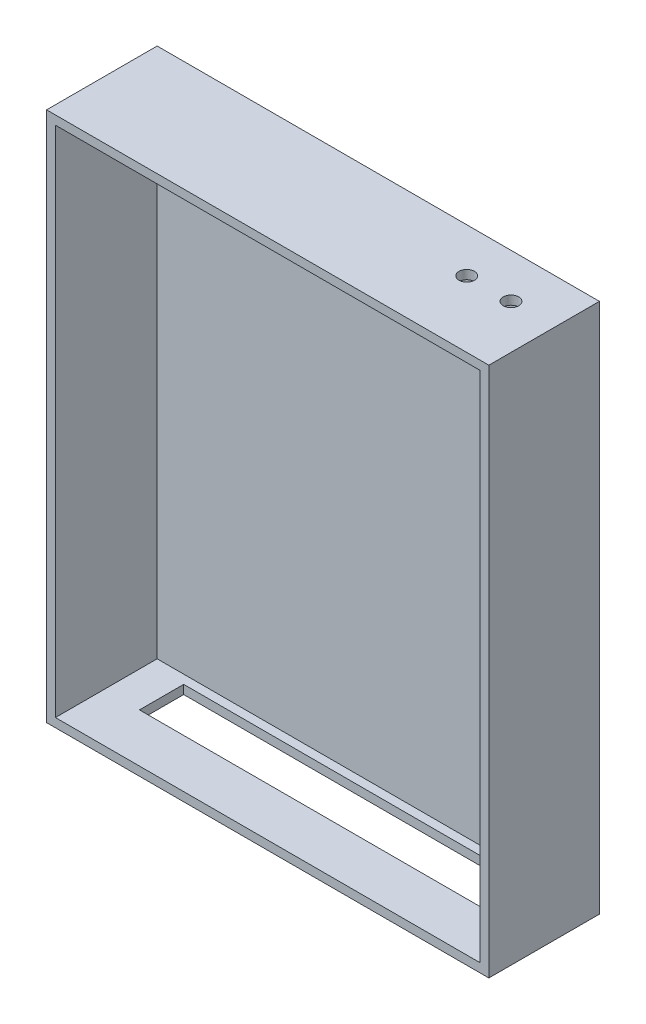
ISO-10303-21;
HEADER;
FILE_DESCRIPTION(('STEP AP214'),'2;1');
FILE_NAME('part.step','',(''),(''),'','','');
FILE_SCHEMA(('AUTOMOTIVE_DESIGN { 1 0 10303 214 1 1 1 1 }'));
ENDSEC;
DATA;
#1=APPLICATION_CONTEXT('core data for automotive mechanical design processes');
#2=APPLICATION_PROTOCOL_DEFINITION('international standard','automotive_design',2000,#1);
#3=PRODUCT_CONTEXT('',#1,'mechanical');
#4=PRODUCT('Part','Part','',(#3));
#5=PRODUCT_RELATED_PRODUCT_CATEGORY('part','',(#4));
#6=PRODUCT_DEFINITION_FORMATION('','',#4);
#7=PRODUCT_DEFINITION_CONTEXT('part definition',#1,'design');
#8=PRODUCT_DEFINITION('design','',#6,#7);
#9=PRODUCT_DEFINITION_SHAPE('','',#8);
#10=(LENGTH_UNIT() NAMED_UNIT(*) SI_UNIT(.MILLI.,.METRE.));
#11=(NAMED_UNIT(*) PLANE_ANGLE_UNIT() SI_UNIT($,.RADIAN.));
#12=(NAMED_UNIT(*) SI_UNIT($,.STERADIAN.) SOLID_ANGLE_UNIT());
#13=UNCERTAINTY_MEASURE_WITH_UNIT(LENGTH_MEASURE(1.E-05),#10,'distance_accuracy_value','');
#14=(GEOMETRIC_REPRESENTATION_CONTEXT(3) GLOBAL_UNCERTAINTY_ASSIGNED_CONTEXT((#13)) GLOBAL_UNIT_ASSIGNED_CONTEXT((#10,
#11,#12)) REPRESENTATION_CONTEXT('',''));
#15=CARTESIAN_POINT('',(0.,0.,0.));
#16=DIRECTION('',(0.,0.,1.));
#17=DIRECTION('',(1.,0.,0.));
#18=AXIS2_PLACEMENT_3D('',#15,#16,#17);
#19=CARTESIAN_POINT('',(0.,0.,0.));
#20=DIRECTION('',(0.,0.,1.));
#21=DIRECTION('',(1.,0.,0.));
#22=AXIS2_PLACEMENT_3D('',#19,#20,#21);
#23=PLANE('',#22);
#24=DIRECTION('',(1.,0.,0.));
#25=VECTOR('',#24,1.);
#26=CARTESIAN_POINT('',(100.,-60.,0.));
#27=LINE('',#26,#25);
#28=CARTESIAN_POINT('',(0.,-60.,0.));
#29=VERTEX_POINT('',#28);
#30=CARTESIAN_POINT('',(100.,-60.,0.));
#31=VERTEX_POINT('',#30);
#32=EDGE_CURVE('E163',#29,#31,#27,.T.);
#33=ORIENTED_EDGE('',*,*,#32,.T.);
#34=DIRECTION('',(0.,1.,0.));
#35=VECTOR('',#34,1.);
#36=CARTESIAN_POINT('',(100.,0.,0.));
#37=LINE('',#36,#35);
#38=CARTESIAN_POINT('',(100.,60.,0.));
#39=VERTEX_POINT('',#38);
#40=EDGE_CURVE('E158',#31,#39,#37,.T.);
#41=ORIENTED_EDGE('',*,*,#40,.T.);
#42=DIRECTION('',(-1.,0.,0.));
#43=VECTOR('',#42,1.);
#44=CARTESIAN_POINT('',(100.,60.,0.));
#45=LINE('',#44,#43);
#46=CARTESIAN_POINT('',(0.,60.,0.));
#47=VERTEX_POINT('',#46);
#48=EDGE_CURVE('E270',#39,#47,#45,.T.);
#49=ORIENTED_EDGE('',*,*,#48,.T.);
#50=DIRECTION('',(0.,1.,0.));
#51=VECTOR('',#50,1.);
#52=CARTESIAN_POINT('',(0.,0.,0.));
#53=LINE('',#52,#51);
#54=EDGE_CURVE('E153',#29,#47,#53,.T.);
#55=ORIENTED_EDGE('',*,*,#54,.F.);
#56=EDGE_LOOP('',(#33,#41,#49,#55));
#57=FACE_BOUND('',#56,.T.);
#58=DIRECTION('',(0.,1.,0.));
#59=VECTOR('',#58,1.);
#60=CARTESIAN_POINT('',(98.,0.,0.));
#61=LINE('',#60,#59);
#62=CARTESIAN_POINT('',(98.,-58.,0.));
#63=VERTEX_POINT('',#62);
#64=CARTESIAN_POINT('',(98.,58.,0.));
#65=VERTEX_POINT('',#64);
#66=EDGE_CURVE('E212',#63,#65,#61,.T.);
#67=ORIENTED_EDGE('',*,*,#66,.F.);
#68=DIRECTION('',(1.,0.,0.));
#69=VECTOR('',#68,1.);
#70=CARTESIAN_POINT('',(100.,-58.,0.));
#71=LINE('',#70,#69);
#72=CARTESIAN_POINT('',(2.,-58.,0.));
#73=VERTEX_POINT('',#72);
#74=EDGE_CURVE('E152',#73,#63,#71,.T.);
#75=ORIENTED_EDGE('',*,*,#74,.F.);
#76=DIRECTION('',(0.,1.,0.));
#77=VECTOR('',#76,1.);
#78=CARTESIAN_POINT('',(2.,0.,0.));
#79=LINE('',#78,#77);
#80=CARTESIAN_POINT('',(2.,58.,0.));
#81=VERTEX_POINT('',#80);
#82=EDGE_CURVE('E136',#73,#81,#79,.T.);
#83=ORIENTED_EDGE('',*,*,#82,.T.);
#84=DIRECTION('',(-1.,0.,0.));
#85=VECTOR('',#84,1.);
#86=CARTESIAN_POINT('',(100.,58.,0.));
#87=LINE('',#86,#85);
#88=EDGE_CURVE('E147',#65,#81,#87,.T.);
#89=ORIENTED_EDGE('',*,*,#88,.F.);
#90=EDGE_LOOP('',(#67,#75,#83,#89));
#91=FACE_BOUND('',#90,.T.);
#92=ADVANCED_FACE('F40',(#57,#91),#23,.T.);
#93=CARTESIAN_POINT('',(100.,60.,25.));
#94=DIRECTION('',(0.,-1.,0.));
#95=DIRECTION('',(0.,0.,-1.));
#96=AXIS2_PLACEMENT_3D('',#93,#94,#95);
#97=PLANE('',#96);
#98=CARTESIAN_POINT('',(90.,60.,-15.));
#99=DIRECTION('',(0.,1.,0.));
#100=DIRECTION('',(0.,0.,1.));
#101=AXIS2_PLACEMENT_3D('',#98,#99,#100);
#102=CIRCLE('',#101,1.75);
#103=CARTESIAN_POINT('',(90.,60.,-13.25));
#104=VERTEX_POINT('',#103);
#105=EDGE_CURVE('E195',#104,#104,#102,.T.);
#106=ORIENTED_EDGE('',*,*,#105,.F.);
#107=EDGE_LOOP('',(#106));
#108=FACE_BOUND('',#107,.T.);
#109=CARTESIAN_POINT('',(80.,60.,-15.));
#110=DIRECTION('',(0.,1.,0.));
#111=DIRECTION('',(0.,0.,1.));
#112=AXIS2_PLACEMENT_3D('',#109,#110,#111);
#113=CIRCLE('',#112,1.75);
#114=CARTESIAN_POINT('',(80.,60.,-13.25));
#115=VERTEX_POINT('',#114);
#116=EDGE_CURVE('E200',#115,#115,#113,.T.);
#117=ORIENTED_EDGE('',*,*,#116,.F.);
#118=EDGE_LOOP('',(#117));
#119=FACE_BOUND('',#118,.T.);
#120=ORIENTED_EDGE('',*,*,#48,.F.);
#121=DIRECTION('',(0.,0.,1.));
#122=VECTOR('',#121,1.);
#123=CARTESIAN_POINT('',(100.,60.,25.));
#124=LINE('',#123,#122);
#125=CARTESIAN_POINT('',(100.,60.,-25.));
#126=VERTEX_POINT('',#125);
#127=EDGE_CURVE('E172',#126,#39,#124,.T.);
#128=ORIENTED_EDGE('',*,*,#127,.F.);
#129=DIRECTION('',(-1.,0.,0.));
#130=VECTOR('',#129,1.);
#131=CARTESIAN_POINT('',(100.,60.,-25.));
#132=LINE('',#131,#130);
#133=CARTESIAN_POINT('',(0.,60.,-25.));
#134=VERTEX_POINT('',#133);
#135=EDGE_CURVE('E221',#126,#134,#132,.T.);
#136=ORIENTED_EDGE('',*,*,#135,.T.);
#137=DIRECTION('',(0.,0.,1.));
#138=VECTOR('',#137,1.);
#139=CARTESIAN_POINT('',(0.,60.,25.));
#140=LINE('',#139,#138);
#141=EDGE_CURVE('E180',#134,#47,#140,.T.);
#142=ORIENTED_EDGE('',*,*,#141,.T.);
#143=EDGE_LOOP('',(#120,#128,#136,#142));
#144=FACE_BOUND('',#143,.T.);
#145=ADVANCED_FACE('F286',(#108,#119,#144),#97,.F.);
#146=CARTESIAN_POINT('',(100.,-60.,25.));
#147=DIRECTION('',(0.,1.,0.));
#148=DIRECTION('',(0.,0.,1.));
#149=AXIS2_PLACEMENT_3D('',#146,#147,#148);
#150=PLANE('',#149);
#151=DIRECTION('',(-1.,0.,0.));
#152=VECTOR('',#151,1.);
#153=CARTESIAN_POINT('',(9.99999999999999,-60.,-11.));
#154=LINE('',#153,#152);
#155=CARTESIAN_POINT('',(90.,-60.,-11.));
#156=VERTEX_POINT('',#155);
#157=CARTESIAN_POINT('',(9.99999999999999,-60.,-11.));
#158=VERTEX_POINT('',#157);
#159=EDGE_CURVE('E50',#156,#158,#154,.T.);
#160=ORIENTED_EDGE('',*,*,#159,.F.);
#161=DIRECTION('',(0.,0.,1.));
#162=VECTOR('',#161,1.);
#163=CARTESIAN_POINT('',(90.,-60.,-11.));
#164=LINE('',#163,#162);
#165=CARTESIAN_POINT('',(90.,-60.,-21.));
#166=VERTEX_POINT('',#165);
#167=EDGE_CURVE('E11',#166,#156,#164,.T.);
#168=ORIENTED_EDGE('',*,*,#167,.F.);
#169=DIRECTION('',(1.,0.,0.));
#170=VECTOR('',#169,1.);
#171=CARTESIAN_POINT('',(10.,-60.,-21.));
#172=LINE('',#171,#170);
#173=CARTESIAN_POINT('',(10.,-60.,-21.));
#174=VERTEX_POINT('',#173);
#175=EDGE_CURVE('E250',#174,#166,#172,.T.);
#176=ORIENTED_EDGE('',*,*,#175,.F.);
#177=DIRECTION('',(0.,0.,-1.));
#178=VECTOR('',#177,1.);
#179=CARTESIAN_POINT('',(9.99999999999999,-60.,-11.));
#180=LINE('',#179,#178);
#181=EDGE_CURVE('E259',#158,#174,#180,.T.);
#182=ORIENTED_EDGE('',*,*,#181,.F.);
#183=EDGE_LOOP('',(#160,#168,#176,#182));
#184=FACE_BOUND('',#183,.T.);
#185=ORIENTED_EDGE('',*,*,#32,.F.);
#186=DIRECTION('',(0.,0.,-1.));
#187=VECTOR('',#186,1.);
#188=CARTESIAN_POINT('',(0.,-60.,25.));
#189=LINE('',#188,#187);
#190=CARTESIAN_POINT('',(0.,-60.,-25.));
#191=VERTEX_POINT('',#190);
#192=EDGE_CURVE('E177',#29,#191,#189,.T.);
#193=ORIENTED_EDGE('',*,*,#192,.T.);
#194=DIRECTION('',(-1.,0.,0.));
#195=VECTOR('',#194,1.);
#196=CARTESIAN_POINT('',(100.,-60.,-25.));
#197=LINE('',#196,#195);
#198=CARTESIAN_POINT('',(100.,-60.,-25.));
#199=VERTEX_POINT('',#198);
#200=EDGE_CURVE('E173',#199,#191,#197,.T.);
#201=ORIENTED_EDGE('',*,*,#200,.F.);
#202=DIRECTION('',(0.,0.,-1.));
#203=VECTOR('',#202,1.);
#204=CARTESIAN_POINT('',(100.,-60.,25.));
#205=LINE('',#204,#203);
#206=EDGE_CURVE('E169',#31,#199,#205,.T.);
#207=ORIENTED_EDGE('',*,*,#206,.F.);
#208=EDGE_LOOP('',(#185,#193,#201,#207));
#209=FACE_BOUND('',#208,.T.);
#210=ADVANCED_FACE('F290',(#184,#209),#150,.F.);
#211=CARTESIAN_POINT('',(100.,0.,0.));
#212=DIRECTION('',(-1.,0.,0.));
#213=DIRECTION('',(0.,0.,1.));
#214=AXIS2_PLACEMENT_3D('',#211,#212,#213);
#215=PLANE('',#214);
#216=ORIENTED_EDGE('',*,*,#40,.F.);
#217=ORIENTED_EDGE('',*,*,#206,.T.);
#218=DIRECTION('',(0.,1.,0.));
#219=VECTOR('',#218,1.);
#220=CARTESIAN_POINT('',(100.,-60.,-25.));
#221=LINE('',#220,#219);
#222=EDGE_CURVE('E176',#199,#126,#221,.T.);
#223=ORIENTED_EDGE('',*,*,#222,.T.);
#224=ORIENTED_EDGE('',*,*,#127,.T.);
#225=EDGE_LOOP('',(#216,#217,#223,#224));
#226=FACE_BOUND('',#225,.T.);
#227=ADVANCED_FACE('F42',(#226),#215,.F.);
#228=CARTESIAN_POINT('',(0.,0.,0.));
#229=DIRECTION('',(-1.,0.,0.));
#230=DIRECTION('',(0.,0.,1.));
#231=AXIS2_PLACEMENT_3D('',#228,#229,#230);
#232=PLANE('',#231);
#233=ORIENTED_EDGE('',*,*,#192,.F.);
#234=ORIENTED_EDGE('',*,*,#54,.T.);
#235=ORIENTED_EDGE('',*,*,#141,.F.);
#236=DIRECTION('',(0.,1.,0.));
#237=VECTOR('',#236,1.);
#238=CARTESIAN_POINT('',(0.,-60.,-25.));
#239=LINE('',#238,#237);
#240=EDGE_CURVE('E184',#191,#134,#239,.T.);
#241=ORIENTED_EDGE('',*,*,#240,.F.);
#242=EDGE_LOOP('',(#233,#234,#235,#241));
#243=FACE_BOUND('',#242,.T.);
#244=ADVANCED_FACE('F289',(#243),#232,.T.);
#245=CARTESIAN_POINT('',(100.,58.,25.));
#246=DIRECTION('',(0.,-1.,0.));
#247=DIRECTION('',(0.,0.,-1.));
#248=AXIS2_PLACEMENT_3D('',#245,#246,#247);
#249=PLANE('',#248);
#250=CARTESIAN_POINT('',(90.,58.,-15.));
#251=DIRECTION('',(0.,-1.,0.));
#252=DIRECTION('',(0.,0.,-1.));
#253=AXIS2_PLACEMENT_3D('',#250,#251,#252);
#254=CIRCLE('',#253,1.75);
#255=CARTESIAN_POINT('',(90.,58.,-16.75));
#256=VERTEX_POINT('',#255);
#257=EDGE_CURVE('E44',#256,#256,#254,.T.);
#258=ORIENTED_EDGE('',*,*,#257,.F.);
#259=EDGE_LOOP('',(#258));
#260=FACE_BOUND('',#259,.T.);
#261=CARTESIAN_POINT('',(80.,58.,-15.));
#262=DIRECTION('',(0.,-1.,0.));
#263=DIRECTION('',(0.,0.,-1.));
#264=AXIS2_PLACEMENT_3D('',#261,#262,#263);
#265=CIRCLE('',#264,1.75);
#266=CARTESIAN_POINT('',(80.,58.,-16.75));
#267=VERTEX_POINT('',#266);
#268=EDGE_CURVE('E166',#267,#267,#265,.T.);
#269=ORIENTED_EDGE('',*,*,#268,.F.);
#270=EDGE_LOOP('',(#269));
#271=FACE_BOUND('',#270,.T.);
#272=DIRECTION('',(0.,0.,1.));
#273=VECTOR('',#272,1.);
#274=CARTESIAN_POINT('',(98.,58.,0.));
#275=LINE('',#274,#273);
#276=CARTESIAN_POINT('',(98.,58.,-23.));
#277=VERTEX_POINT('',#276);
#278=EDGE_CURVE('E149',#277,#65,#275,.T.);
#279=ORIENTED_EDGE('',*,*,#278,.T.);
#280=ORIENTED_EDGE('',*,*,#88,.T.);
#281=DIRECTION('',(0.,0.,1.));
#282=VECTOR('',#281,1.);
#283=CARTESIAN_POINT('',(2.,58.,0.));
#284=LINE('',#283,#282);
#285=CARTESIAN_POINT('',(2.,58.,-23.));
#286=VERTEX_POINT('',#285);
#287=EDGE_CURVE('E132',#286,#81,#284,.T.);
#288=ORIENTED_EDGE('',*,*,#287,.F.);
#289=DIRECTION('',(-1.,0.,0.));
#290=VECTOR('',#289,1.);
#291=CARTESIAN_POINT('',(100.,58.,-23.));
#292=LINE('',#291,#290);
#293=EDGE_CURVE('E231',#277,#286,#292,.T.);
#294=ORIENTED_EDGE('',*,*,#293,.F.);
#295=EDGE_LOOP('',(#279,#280,#288,#294));
#296=FACE_BOUND('',#295,.T.);
#297=ADVANCED_FACE('F148',(#260,#271,#296),#249,.T.);
#298=CARTESIAN_POINT('',(100.,-58.,25.));
#299=DIRECTION('',(0.,1.,0.));
#300=DIRECTION('',(0.,0.,1.));
#301=AXIS2_PLACEMENT_3D('',#298,#299,#300);
#302=PLANE('',#301);
#303=DIRECTION('',(0.,0.,-1.));
#304=VECTOR('',#303,1.);
#305=CARTESIAN_POINT('',(90.,-58.,25.));
#306=LINE('',#305,#304);
#307=CARTESIAN_POINT('',(90.,-58.,-11.));
#308=VERTEX_POINT('',#307);
#309=CARTESIAN_POINT('',(90.,-58.,-21.));
#310=VERTEX_POINT('',#309);
#311=EDGE_CURVE('E208',#308,#310,#306,.T.);
#312=ORIENTED_EDGE('',*,*,#311,.F.);
#313=DIRECTION('',(1.,0.,0.));
#314=VECTOR('',#313,1.);
#315=CARTESIAN_POINT('',(100.,-58.,-11.));
#316=LINE('',#315,#314);
#317=CARTESIAN_POINT('',(9.99999999999999,-58.,-11.));
#318=VERTEX_POINT('',#317);
#319=EDGE_CURVE('E218',#318,#308,#316,.T.);
#320=ORIENTED_EDGE('',*,*,#319,.F.);
#321=DIRECTION('',(0.,0.,1.));
#322=VECTOR('',#321,1.);
#323=CARTESIAN_POINT('',(9.99999999999999,-58.,25.));
#324=LINE('',#323,#322);
#325=CARTESIAN_POINT('',(10.,-58.,-21.));
#326=VERTEX_POINT('',#325);
#327=EDGE_CURVE('E215',#326,#318,#324,.T.);
#328=ORIENTED_EDGE('',*,*,#327,.F.);
#329=DIRECTION('',(-1.,0.,0.));
#330=VECTOR('',#329,1.);
#331=CARTESIAN_POINT('',(100.,-58.,-21.));
#332=LINE('',#331,#330);
#333=EDGE_CURVE('E211',#310,#326,#332,.T.);
#334=ORIENTED_EDGE('',*,*,#333,.F.);
#335=EDGE_LOOP('',(#312,#320,#328,#334));
#336=FACE_BOUND('',#335,.T.);
#337=DIRECTION('',(0.,0.,-1.));
#338=VECTOR('',#337,1.);
#339=CARTESIAN_POINT('',(2.,-58.,0.));
#340=LINE('',#339,#338);
#341=CARTESIAN_POINT('',(2.,-58.,-23.));
#342=VERTEX_POINT('',#341);
#343=EDGE_CURVE('E143',#73,#342,#340,.T.);
#344=ORIENTED_EDGE('',*,*,#343,.F.);
#345=ORIENTED_EDGE('',*,*,#74,.T.);
#346=DIRECTION('',(0.,0.,-1.));
#347=VECTOR('',#346,1.);
#348=CARTESIAN_POINT('',(98.,-58.,0.));
#349=LINE('',#348,#347);
#350=CARTESIAN_POINT('',(98.,-58.,-23.));
#351=VERTEX_POINT('',#350);
#352=EDGE_CURVE('E185',#63,#351,#349,.T.);
#353=ORIENTED_EDGE('',*,*,#352,.T.);
#354=DIRECTION('',(-1.,0.,0.));
#355=VECTOR('',#354,1.);
#356=CARTESIAN_POINT('',(100.,-58.,-23.));
#357=LINE('',#356,#355);
#358=EDGE_CURVE('E188',#351,#342,#357,.T.);
#359=ORIENTED_EDGE('',*,*,#358,.T.);
#360=EDGE_LOOP('',(#344,#345,#353,#359));
#361=FACE_BOUND('',#360,.T.);
#362=ADVANCED_FACE('F326',(#336,#361),#302,.T.);
#363=CARTESIAN_POINT('',(98.,0.,0.));
#364=DIRECTION('',(-1.,0.,0.));
#365=DIRECTION('',(0.,0.,1.));
#366=AXIS2_PLACEMENT_3D('',#363,#364,#365);
#367=PLANE('',#366);
#368=ORIENTED_EDGE('',*,*,#352,.F.);
#369=ORIENTED_EDGE('',*,*,#66,.T.);
#370=ORIENTED_EDGE('',*,*,#278,.F.);
#371=DIRECTION('',(0.,1.,0.));
#372=VECTOR('',#371,1.);
#373=CARTESIAN_POINT('',(98.,0.,-23.));
#374=LINE('',#373,#372);
#375=EDGE_CURVE('E191',#351,#277,#374,.T.);
#376=ORIENTED_EDGE('',*,*,#375,.F.);
#377=EDGE_LOOP('',(#368,#369,#370,#376));
#378=FACE_BOUND('',#377,.T.);
#379=ADVANCED_FACE('F302',(#378),#367,.T.);
#380=CARTESIAN_POINT('',(2.,0.,0.));
#381=DIRECTION('',(-1.,0.,0.));
#382=DIRECTION('',(0.,0.,1.));
#383=AXIS2_PLACEMENT_3D('',#380,#381,#382);
#384=PLANE('',#383);
#385=ORIENTED_EDGE('',*,*,#82,.F.);
#386=ORIENTED_EDGE('',*,*,#343,.T.);
#387=DIRECTION('',(0.,1.,0.));
#388=VECTOR('',#387,1.);
#389=CARTESIAN_POINT('',(2.,0.,-23.));
#390=LINE('',#389,#388);
#391=EDGE_CURVE('E138',#342,#286,#390,.T.);
#392=ORIENTED_EDGE('',*,*,#391,.T.);
#393=ORIENTED_EDGE('',*,*,#287,.T.);
#394=EDGE_LOOP('',(#385,#386,#392,#393));
#395=FACE_BOUND('',#394,.T.);
#396=ADVANCED_FACE('F134',(#395),#384,.F.);
#397=CARTESIAN_POINT('',(100.,-60.,-25.));
#398=DIRECTION('',(0.,0.,1.));
#399=DIRECTION('',(1.,0.,0.));
#400=AXIS2_PLACEMENT_3D('',#397,#398,#399);
#401=PLANE('',#400);
#402=ORIENTED_EDGE('',*,*,#240,.T.);
#403=ORIENTED_EDGE('',*,*,#135,.F.);
#404=ORIENTED_EDGE('',*,*,#222,.F.);
#405=ORIENTED_EDGE('',*,*,#200,.T.);
#406=EDGE_LOOP('',(#402,#403,#404,#405));
#407=FACE_BOUND('',#406,.T.);
#408=ADVANCED_FACE('F292',(#407),#401,.F.);
#409=CARTESIAN_POINT('',(100.,-60.,-23.));
#410=DIRECTION('',(0.,0.,1.));
#411=DIRECTION('',(1.,0.,0.));
#412=AXIS2_PLACEMENT_3D('',#409,#410,#411);
#413=PLANE('',#412);
#414=ORIENTED_EDGE('',*,*,#391,.F.);
#415=ORIENTED_EDGE('',*,*,#358,.F.);
#416=ORIENTED_EDGE('',*,*,#375,.T.);
#417=ORIENTED_EDGE('',*,*,#293,.T.);
#418=EDGE_LOOP('',(#414,#415,#416,#417));
#419=FACE_BOUND('',#418,.T.);
#420=ADVANCED_FACE('F294',(#419),#413,.T.);
#421=CARTESIAN_POINT('',(90.,-57.,-11.));
#422=DIRECTION('',(1.,0.,0.));
#423=DIRECTION('',(0.,0.,-1.));
#424=AXIS2_PLACEMENT_3D('',#421,#422,#423);
#425=PLANE('',#424);
#426=ORIENTED_EDGE('',*,*,#311,.T.);
#427=DIRECTION('',(0.,-1.,0.));
#428=VECTOR('',#427,1.);
#429=CARTESIAN_POINT('',(90.,-57.,-21.));
#430=LINE('',#429,#428);
#431=EDGE_CURVE('E245',#310,#166,#430,.T.);
#432=ORIENTED_EDGE('',*,*,#431,.T.);
#433=ORIENTED_EDGE('',*,*,#167,.T.);
#434=DIRECTION('',(0.,-1.,0.));
#435=VECTOR('',#434,1.);
#436=CARTESIAN_POINT('',(90.,-57.,-11.));
#437=LINE('',#436,#435);
#438=EDGE_CURVE('E246',#308,#156,#437,.T.);
#439=ORIENTED_EDGE('',*,*,#438,.F.);
#440=EDGE_LOOP('',(#426,#432,#433,#439));
#441=FACE_BOUND('',#440,.T.);
#442=ADVANCED_FACE('F298',(#441),#425,.F.);
#443=CARTESIAN_POINT('',(10.,-57.,-21.));
#444=DIRECTION('',(0.,0.,-1.));
#445=DIRECTION('',(-1.,0.,0.));
#446=AXIS2_PLACEMENT_3D('',#443,#444,#445);
#447=PLANE('',#446);
#448=ORIENTED_EDGE('',*,*,#333,.T.);
#449=DIRECTION('',(0.,-1.,0.));
#450=VECTOR('',#449,1.);
#451=CARTESIAN_POINT('',(10.,-57.,-21.));
#452=LINE('',#451,#450);
#453=EDGE_CURVE('E66',#326,#174,#452,.T.);
#454=ORIENTED_EDGE('',*,*,#453,.T.);
#455=ORIENTED_EDGE('',*,*,#175,.T.);
#456=ORIENTED_EDGE('',*,*,#431,.F.);
#457=EDGE_LOOP('',(#448,#454,#455,#456));
#458=FACE_BOUND('',#457,.T.);
#459=ADVANCED_FACE('F396',(#458),#447,.F.);
#460=CARTESIAN_POINT('',(9.99999999999999,-57.,-11.));
#461=DIRECTION('',(-1.,0.,0.));
#462=DIRECTION('',(0.,0.,1.));
#463=AXIS2_PLACEMENT_3D('',#460,#461,#462);
#464=PLANE('',#463);
#465=ORIENTED_EDGE('',*,*,#327,.T.);
#466=DIRECTION('',(0.,-1.,0.));
#467=VECTOR('',#466,1.);
#468=CARTESIAN_POINT('',(9.99999999999999,-57.,-11.));
#469=LINE('',#468,#467);
#470=EDGE_CURVE('E58',#318,#158,#469,.T.);
#471=ORIENTED_EDGE('',*,*,#470,.T.);
#472=ORIENTED_EDGE('',*,*,#181,.T.);
#473=ORIENTED_EDGE('',*,*,#453,.F.);
#474=EDGE_LOOP('',(#465,#471,#472,#473));
#475=FACE_BOUND('',#474,.T.);
#476=ADVANCED_FACE('F405',(#475),#464,.F.);
#477=CARTESIAN_POINT('',(9.99999999999999,-57.,-11.));
#478=DIRECTION('',(0.,0.,1.));
#479=DIRECTION('',(1.,0.,0.));
#480=AXIS2_PLACEMENT_3D('',#477,#478,#479);
#481=PLANE('',#480);
#482=ORIENTED_EDGE('',*,*,#319,.T.);
#483=ORIENTED_EDGE('',*,*,#438,.T.);
#484=ORIENTED_EDGE('',*,*,#159,.T.);
#485=ORIENTED_EDGE('',*,*,#470,.F.);
#486=EDGE_LOOP('',(#482,#483,#484,#485));
#487=FACE_BOUND('',#486,.T.);
#488=ADVANCED_FACE('F318',(#487),#481,.F.);
#489=CARTESIAN_POINT('',(80.,50.,-15.));
#490=DIRECTION('',(0.,1.,0.));
#491=DIRECTION('',(0.,0.,1.));
#492=AXIS2_PLACEMENT_3D('',#489,#490,#491);
#493=CYLINDRICAL_SURFACE('',#492,1.75);
#494=ORIENTED_EDGE('',*,*,#268,.T.);
#495=EDGE_LOOP('',(#494));
#496=FACE_BOUND('',#495,.T.);
#497=ORIENTED_EDGE('',*,*,#116,.T.);
#498=EDGE_LOOP('',(#497));
#499=FACE_BOUND('',#498,.T.);
#500=ADVANCED_FACE('F317',(#496,#499),#493,.F.);
#501=CARTESIAN_POINT('',(90.,50.,-15.));
#502=DIRECTION('',(0.,1.,0.));
#503=DIRECTION('',(0.,0.,1.));
#504=AXIS2_PLACEMENT_3D('',#501,#502,#503);
#505=CYLINDRICAL_SURFACE('',#504,1.75);
#506=ORIENTED_EDGE('',*,*,#257,.T.);
#507=EDGE_LOOP('',(#506));
#508=FACE_BOUND('',#507,.T.);
#509=ORIENTED_EDGE('',*,*,#105,.T.);
#510=EDGE_LOOP('',(#509));
#511=FACE_BOUND('',#510,.T.);
#512=ADVANCED_FACE('F427',(#508,#511),#505,.F.);
#513=CLOSED_SHELL('',(#92,#145,#210,#227,#244,#297,#362,#379,#396,#408,#420,#442,#459,#476,#488,
#500,#512));
#514=MANIFOLD_SOLID_BREP('B2',#513);
#515=ADVANCED_BREP_SHAPE_REPRESENTATION('',(#18,#514),#14);
#516=SHAPE_DEFINITION_REPRESENTATION(#9,#515);
ENDSEC;
END-ISO-10303-21;
